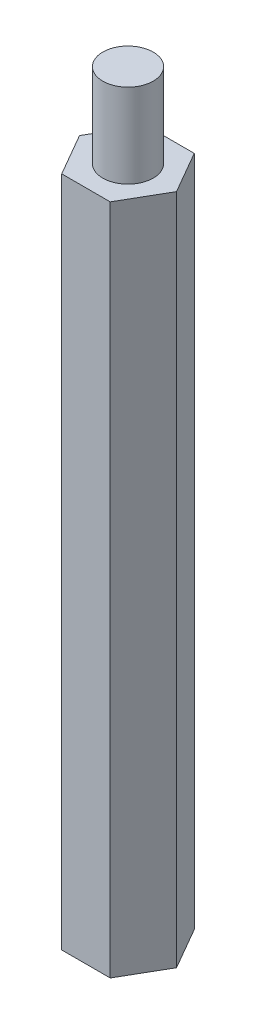
ISO-10303-21;
HEADER;
FILE_DESCRIPTION(('STEP AP214'),'2;1');
FILE_NAME('part.step','',(''),(''),'','','');
FILE_SCHEMA(('AUTOMOTIVE_DESIGN { 1 0 10303 214 1 1 1 1 }'));
ENDSEC;
DATA;
#1=APPLICATION_CONTEXT('core data for automotive mechanical design processes');
#2=APPLICATION_PROTOCOL_DEFINITION('international standard','automotive_design',2000,#1);
#3=PRODUCT_CONTEXT('',#1,'mechanical');
#4=PRODUCT('Part','Part','',(#3));
#5=PRODUCT_RELATED_PRODUCT_CATEGORY('part','',(#4));
#6=PRODUCT_DEFINITION_FORMATION('','',#4);
#7=PRODUCT_DEFINITION_CONTEXT('part definition',#1,'design');
#8=PRODUCT_DEFINITION('design','',#6,#7);
#9=PRODUCT_DEFINITION_SHAPE('','',#8);
#10=(LENGTH_UNIT() NAMED_UNIT(*) SI_UNIT(.MILLI.,.METRE.));
#11=(NAMED_UNIT(*) PLANE_ANGLE_UNIT() SI_UNIT($,.RADIAN.));
#12=(NAMED_UNIT(*) SI_UNIT($,.STERADIAN.) SOLID_ANGLE_UNIT());
#13=UNCERTAINTY_MEASURE_WITH_UNIT(LENGTH_MEASURE(1.E-05),#10,'distance_accuracy_value','');
#14=(GEOMETRIC_REPRESENTATION_CONTEXT(3) GLOBAL_UNCERTAINTY_ASSIGNED_CONTEXT((#13)) GLOBAL_UNIT_ASSIGNED_CONTEXT((#10,
#11,#12)) REPRESENTATION_CONTEXT('',''));
#15=CARTESIAN_POINT('',(0.,0.,0.));
#16=DIRECTION('',(0.,0.,1.));
#17=DIRECTION('',(1.,0.,0.));
#18=AXIS2_PLACEMENT_3D('',#15,#16,#17);
#19=CARTESIAN_POINT('',(-2.88675134594813,40.,0.));
#20=DIRECTION('',(0.866025403784438,0.,-0.5));
#21=DIRECTION('',(-0.5,0.,-0.866025403784438));
#22=AXIS2_PLACEMENT_3D('',#19,#20,#21);
#23=PLANE('',#22);
#24=DIRECTION('',(0.5,0.,0.866025403784438));
#25=VECTOR('',#24,1.);
#26=CARTESIAN_POINT('',(-2.88675134594813,0.,0.));
#27=LINE('',#26,#25);
#28=CARTESIAN_POINT('',(-2.88675134594813,0.,0.));
#29=VERTEX_POINT('',#28);
#30=CARTESIAN_POINT('',(-1.44337567297406,0.,2.5));
#31=VERTEX_POINT('',#30);
#32=EDGE_CURVE('E119',#29,#31,#27,.T.);
#33=ORIENTED_EDGE('',*,*,#32,.T.);
#34=DIRECTION('',(0.,-1.,0.));
#35=VECTOR('',#34,1.);
#36=CARTESIAN_POINT('',(-1.44337567297406,40.,2.5));
#37=LINE('',#36,#35);
#38=CARTESIAN_POINT('',(-1.44337567297406,40.,2.5));
#39=VERTEX_POINT('',#38);
#40=EDGE_CURVE('E36',#39,#31,#37,.T.);
#41=ORIENTED_EDGE('',*,*,#40,.F.);
#42=DIRECTION('',(0.5,0.,0.866025403784438));
#43=VECTOR('',#42,1.);
#44=CARTESIAN_POINT('',(-2.88675134594813,40.,0.));
#45=LINE('',#44,#43);
#46=CARTESIAN_POINT('',(-2.88675134594813,40.,0.));
#47=VERTEX_POINT('',#46);
#48=EDGE_CURVE('E130',#47,#39,#45,.T.);
#49=ORIENTED_EDGE('',*,*,#48,.F.);
#50=DIRECTION('',(0.,-1.,0.));
#51=VECTOR('',#50,1.);
#52=CARTESIAN_POINT('',(-2.88675134594813,40.,0.));
#53=LINE('',#52,#51);
#54=EDGE_CURVE('E115',#47,#29,#53,.T.);
#55=ORIENTED_EDGE('',*,*,#54,.T.);
#56=EDGE_LOOP('',(#33,#41,#49,#55));
#57=FACE_BOUND('',#56,.T.);
#58=ADVANCED_FACE('F33',(#57),#23,.F.);
#59=CARTESIAN_POINT('',(-1.44337567297406,40.,2.5));
#60=DIRECTION('',(0.,0.,-1.));
#61=DIRECTION('',(-1.,0.,0.));
#62=AXIS2_PLACEMENT_3D('',#59,#60,#61);
#63=PLANE('',#62);
#64=DIRECTION('',(1.,0.,0.));
#65=VECTOR('',#64,1.);
#66=CARTESIAN_POINT('',(-1.44337567297406,0.,2.5));
#67=LINE('',#66,#65);
#68=CARTESIAN_POINT('',(1.44337567297407,0.,2.5));
#69=VERTEX_POINT('',#68);
#70=EDGE_CURVE('E122',#31,#69,#67,.T.);
#71=ORIENTED_EDGE('',*,*,#70,.T.);
#72=DIRECTION('',(0.,-1.,0.));
#73=VECTOR('',#72,1.);
#74=CARTESIAN_POINT('',(1.44337567297407,40.,2.5));
#75=LINE('',#74,#73);
#76=CARTESIAN_POINT('',(1.44337567297407,40.,2.5));
#77=VERTEX_POINT('',#76);
#78=EDGE_CURVE('E133',#77,#69,#75,.T.);
#79=ORIENTED_EDGE('',*,*,#78,.F.);
#80=DIRECTION('',(1.,0.,0.));
#81=VECTOR('',#80,1.);
#82=CARTESIAN_POINT('',(-1.44337567297406,40.,2.5));
#83=LINE('',#82,#81);
#84=EDGE_CURVE('E88',#39,#77,#83,.T.);
#85=ORIENTED_EDGE('',*,*,#84,.F.);
#86=ORIENTED_EDGE('',*,*,#40,.T.);
#87=EDGE_LOOP('',(#71,#79,#85,#86));
#88=FACE_BOUND('',#87,.T.);
#89=ADVANCED_FACE('F138',(#88),#63,.F.);
#90=CARTESIAN_POINT('',(1.44337567297407,40.,2.5));
#91=DIRECTION('',(-0.866025403784439,0.,-0.5));
#92=DIRECTION('',(-0.5,0.,0.866025403784439));
#93=AXIS2_PLACEMENT_3D('',#90,#91,#92);
#94=PLANE('',#93);
#95=DIRECTION('',(0.5,0.,-0.866025403784439));
#96=VECTOR('',#95,1.);
#97=CARTESIAN_POINT('',(1.44337567297407,0.,2.5));
#98=LINE('',#97,#96);
#99=CARTESIAN_POINT('',(2.88675134594813,0.,0.));
#100=VERTEX_POINT('',#99);
#101=EDGE_CURVE('E125',#69,#100,#98,.T.);
#102=ORIENTED_EDGE('',*,*,#101,.T.);
#103=DIRECTION('',(0.,-1.,0.));
#104=VECTOR('',#103,1.);
#105=CARTESIAN_POINT('',(2.88675134594813,40.,0.));
#106=LINE('',#105,#104);
#107=CARTESIAN_POINT('',(2.88675134594813,40.,0.));
#108=VERTEX_POINT('',#107);
#109=EDGE_CURVE('E110',#108,#100,#106,.T.);
#110=ORIENTED_EDGE('',*,*,#109,.F.);
#111=DIRECTION('',(0.5,0.,-0.866025403784439));
#112=VECTOR('',#111,1.);
#113=CARTESIAN_POINT('',(1.44337567297407,40.,2.5));
#114=LINE('',#113,#112);
#115=EDGE_CURVE('E101',#77,#108,#114,.T.);
#116=ORIENTED_EDGE('',*,*,#115,.F.);
#117=ORIENTED_EDGE('',*,*,#78,.T.);
#118=EDGE_LOOP('',(#102,#110,#116,#117));
#119=FACE_BOUND('',#118,.T.);
#120=ADVANCED_FACE('F144',(#119),#94,.F.);
#121=CARTESIAN_POINT('',(2.88675134594813,40.,0.));
#122=DIRECTION('',(-0.866025403784438,0.,0.5));
#123=DIRECTION('',(0.5,0.,0.866025403784438));
#124=AXIS2_PLACEMENT_3D('',#121,#122,#123);
#125=PLANE('',#124);
#126=DIRECTION('',(-0.5,0.,-0.866025403784438));
#127=VECTOR('',#126,1.);
#128=CARTESIAN_POINT('',(2.88675134594813,0.,0.));
#129=LINE('',#128,#127);
#130=CARTESIAN_POINT('',(1.44337567297406,0.,-2.5));
#131=VERTEX_POINT('',#130);
#132=EDGE_CURVE('E109',#100,#131,#129,.T.);
#133=ORIENTED_EDGE('',*,*,#132,.T.);
#134=DIRECTION('',(0.,-1.,0.));
#135=VECTOR('',#134,1.);
#136=CARTESIAN_POINT('',(1.44337567297406,40.,-2.5));
#137=LINE('',#136,#135);
#138=CARTESIAN_POINT('',(1.44337567297406,40.,-2.5));
#139=VERTEX_POINT('',#138);
#140=EDGE_CURVE('E106',#139,#131,#137,.T.);
#141=ORIENTED_EDGE('',*,*,#140,.F.);
#142=DIRECTION('',(-0.5,0.,-0.866025403784438));
#143=VECTOR('',#142,1.);
#144=CARTESIAN_POINT('',(2.88675134594813,40.,0.));
#145=LINE('',#144,#143);
#146=EDGE_CURVE('E95',#108,#139,#145,.T.);
#147=ORIENTED_EDGE('',*,*,#146,.F.);
#148=ORIENTED_EDGE('',*,*,#109,.T.);
#149=EDGE_LOOP('',(#133,#141,#147,#148));
#150=FACE_BOUND('',#149,.T.);
#151=ADVANCED_FACE('F107',(#150),#125,.F.);
#152=CARTESIAN_POINT('',(1.44337567297406,40.,-2.5));
#153=DIRECTION('',(0.,0.,1.));
#154=DIRECTION('',(1.,0.,0.));
#155=AXIS2_PLACEMENT_3D('',#152,#153,#154);
#156=PLANE('',#155);
#157=DIRECTION('',(-1.,0.,0.));
#158=VECTOR('',#157,1.);
#159=CARTESIAN_POINT('',(1.44337567297406,0.,-2.5));
#160=LINE('',#159,#158);
#161=CARTESIAN_POINT('',(-1.44337567297406,0.,-2.5));
#162=VERTEX_POINT('',#161);
#163=EDGE_CURVE('E73',#131,#162,#160,.T.);
#164=ORIENTED_EDGE('',*,*,#163,.T.);
#165=DIRECTION('',(0.,-1.,0.));
#166=VECTOR('',#165,1.);
#167=CARTESIAN_POINT('',(-1.44337567297406,40.,-2.5));
#168=LINE('',#167,#166);
#169=CARTESIAN_POINT('',(-1.44337567297406,40.,-2.5));
#170=VERTEX_POINT('',#169);
#171=EDGE_CURVE('E111',#170,#162,#168,.T.);
#172=ORIENTED_EDGE('',*,*,#171,.F.);
#173=DIRECTION('',(-1.,0.,0.));
#174=VECTOR('',#173,1.);
#175=CARTESIAN_POINT('',(1.44337567297406,40.,-2.5));
#176=LINE('',#175,#174);
#177=EDGE_CURVE('E99',#139,#170,#176,.T.);
#178=ORIENTED_EDGE('',*,*,#177,.F.);
#179=ORIENTED_EDGE('',*,*,#140,.T.);
#180=EDGE_LOOP('',(#164,#172,#178,#179));
#181=FACE_BOUND('',#180,.T.);
#182=ADVANCED_FACE('F113',(#181),#156,.F.);
#183=CARTESIAN_POINT('',(-1.44337567297406,40.,-2.5));
#184=DIRECTION('',(0.866025403784439,0.,0.5));
#185=DIRECTION('',(0.5,0.,-0.866025403784439));
#186=AXIS2_PLACEMENT_3D('',#183,#184,#185);
#187=PLANE('',#186);
#188=DIRECTION('',(-0.5,0.,0.866025403784439));
#189=VECTOR('',#188,1.);
#190=CARTESIAN_POINT('',(-1.44337567297406,0.,-2.5));
#191=LINE('',#190,#189);
#192=EDGE_CURVE('E79',#162,#29,#191,.T.);
#193=ORIENTED_EDGE('',*,*,#192,.T.);
#194=ORIENTED_EDGE('',*,*,#54,.F.);
#195=DIRECTION('',(-0.5,0.,0.866025403784439));
#196=VECTOR('',#195,1.);
#197=CARTESIAN_POINT('',(-1.44337567297406,40.,-2.5));
#198=LINE('',#197,#196);
#199=EDGE_CURVE('E50',#170,#47,#198,.T.);
#200=ORIENTED_EDGE('',*,*,#199,.F.);
#201=ORIENTED_EDGE('',*,*,#171,.T.);
#202=EDGE_LOOP('',(#193,#194,#200,#201));
#203=FACE_BOUND('',#202,.T.);
#204=ADVANCED_FACE('F177',(#203),#187,.F.);
#205=CARTESIAN_POINT('',(0.,40.,0.));
#206=DIRECTION('',(0.,1.,0.));
#207=DIRECTION('',(0.,0.,1.));
#208=AXIS2_PLACEMENT_3D('',#205,#206,#207);
#209=PLANE('',#208);
#210=CARTESIAN_POINT('',(0.,40.,0.));
#211=DIRECTION('',(0.,1.,0.));
#212=DIRECTION('',(0.,0.,1.));
#213=AXIS2_PLACEMENT_3D('',#210,#211,#212);
#214=CIRCLE('',#213,1.5);
#215=CARTESIAN_POINT('',(0.,40.,1.5));
#216=VERTEX_POINT('',#215);
#217=EDGE_CURVE('E11',#216,#216,#214,.T.);
#218=ORIENTED_EDGE('',*,*,#217,.F.);
#219=EDGE_LOOP('',(#218));
#220=FACE_BOUND('',#219,.T.);
#221=ORIENTED_EDGE('',*,*,#48,.T.);
#222=ORIENTED_EDGE('',*,*,#84,.T.);
#223=ORIENTED_EDGE('',*,*,#115,.T.);
#224=ORIENTED_EDGE('',*,*,#146,.T.);
#225=ORIENTED_EDGE('',*,*,#177,.T.);
#226=ORIENTED_EDGE('',*,*,#199,.T.);
#227=EDGE_LOOP('',(#221,#222,#223,#224,#225,#226));
#228=FACE_BOUND('',#227,.T.);
#229=ADVANCED_FACE('F97',(#220,#228),#209,.T.);
#230=CARTESIAN_POINT('',(0.,0.,0.));
#231=DIRECTION('',(0.,1.,0.));
#232=DIRECTION('',(0.,0.,1.));
#233=AXIS2_PLACEMENT_3D('',#230,#231,#232);
#234=PLANE('',#233);
#235=CARTESIAN_POINT('',(0.,0.,0.));
#236=DIRECTION('',(0.,-1.,0.));
#237=DIRECTION('',(0.,0.,-1.));
#238=AXIS2_PLACEMENT_3D('',#235,#236,#237);
#239=CIRCLE('',#238,1.5);
#240=CARTESIAN_POINT('',(0.,0.,-1.5));
#241=VERTEX_POINT('',#240);
#242=EDGE_CURVE('E151',#241,#241,#239,.T.);
#243=ORIENTED_EDGE('',*,*,#242,.F.);
#244=EDGE_LOOP('',(#243));
#245=FACE_BOUND('',#244,.T.);
#246=ORIENTED_EDGE('',*,*,#32,.F.);
#247=ORIENTED_EDGE('',*,*,#192,.F.);
#248=ORIENTED_EDGE('',*,*,#163,.F.);
#249=ORIENTED_EDGE('',*,*,#132,.F.);
#250=ORIENTED_EDGE('',*,*,#101,.F.);
#251=ORIENTED_EDGE('',*,*,#70,.F.);
#252=EDGE_LOOP('',(#246,#247,#248,#249,#250,#251));
#253=FACE_BOUND('',#252,.T.);
#254=ADVANCED_FACE('F143',(#245,#253),#234,.F.);
#255=CARTESIAN_POINT('',(0.,45.,0.));
#256=DIRECTION('',(0.,-1.,0.));
#257=DIRECTION('',(0.,0.,-1.));
#258=AXIS2_PLACEMENT_3D('',#255,#256,#257);
#259=CYLINDRICAL_SURFACE('',#258,1.5);
#260=CARTESIAN_POINT('',(0.,45.,0.));
#261=DIRECTION('',(0.,1.,0.));
#262=DIRECTION('',(0.,0.,1.));
#263=AXIS2_PLACEMENT_3D('',#260,#261,#262);
#264=CIRCLE('',#263,1.5);
#265=CARTESIAN_POINT('',(0.,45.,1.5));
#266=VERTEX_POINT('',#265);
#267=EDGE_CURVE('E123',#266,#266,#264,.T.);
#268=ORIENTED_EDGE('',*,*,#267,.F.);
#269=EDGE_LOOP('',(#268));
#270=FACE_BOUND('',#269,.T.);
#271=ORIENTED_EDGE('',*,*,#217,.T.);
#272=EDGE_LOOP('',(#271));
#273=FACE_BOUND('',#272,.T.);
#274=ADVANCED_FACE('F167',(#270,#273),#259,.T.);
#275=CARTESIAN_POINT('',(0.,45.,0.));
#276=DIRECTION('',(0.,1.,0.));
#277=DIRECTION('',(0.,0.,1.));
#278=AXIS2_PLACEMENT_3D('',#275,#276,#277);
#279=PLANE('',#278);
#280=ORIENTED_EDGE('',*,*,#267,.T.);
#281=EDGE_LOOP('',(#280));
#282=FACE_BOUND('',#281,.T.);
#283=ADVANCED_FACE('F162',(#282),#279,.T.);
#284=CARTESIAN_POINT('',(0.,6.,0.));
#285=DIRECTION('',(0.,-1.,0.));
#286=DIRECTION('',(0.,0.,-1.));
#287=AXIS2_PLACEMENT_3D('',#284,#285,#286);
#288=CYLINDRICAL_SURFACE('',#287,1.5);
#289=CARTESIAN_POINT('',(0.,6.,0.));
#290=DIRECTION('',(0.,-1.,0.));
#291=DIRECTION('',(0.,0.,-1.));
#292=AXIS2_PLACEMENT_3D('',#289,#290,#291);
#293=CIRCLE('',#292,1.5);
#294=CARTESIAN_POINT('',(0.,6.,-1.5));
#295=VERTEX_POINT('',#294);
#296=EDGE_CURVE('E150',#295,#295,#293,.T.);
#297=ORIENTED_EDGE('',*,*,#296,.F.);
#298=EDGE_LOOP('',(#297));
#299=FACE_BOUND('',#298,.T.);
#300=ORIENTED_EDGE('',*,*,#242,.T.);
#301=EDGE_LOOP('',(#300));
#302=FACE_BOUND('',#301,.T.);
#303=ADVANCED_FACE('F159',(#299,#302),#288,.F.);
#304=CARTESIAN_POINT('',(0.,6.,0.));
#305=DIRECTION('',(0.,-1.,0.));
#306=DIRECTION('',(0.,0.,-1.));
#307=AXIS2_PLACEMENT_3D('',#304,#305,#306);
#308=PLANE('',#307);
#309=ORIENTED_EDGE('',*,*,#296,.T.);
#310=EDGE_LOOP('',(#309));
#311=FACE_BOUND('',#310,.T.);
#312=ADVANCED_FACE('F157',(#311),#308,.T.);
#313=CLOSED_SHELL('',(#58,#89,#120,#151,#182,#204,#229,#254,#274,#283,#303,#312));
#314=MANIFOLD_SOLID_BREP('B2',#313);
#315=ADVANCED_BREP_SHAPE_REPRESENTATION('',(#18,#314),#14);
#316=SHAPE_DEFINITION_REPRESENTATION(#9,#315);
ENDSEC;
END-ISO-10303-21;
